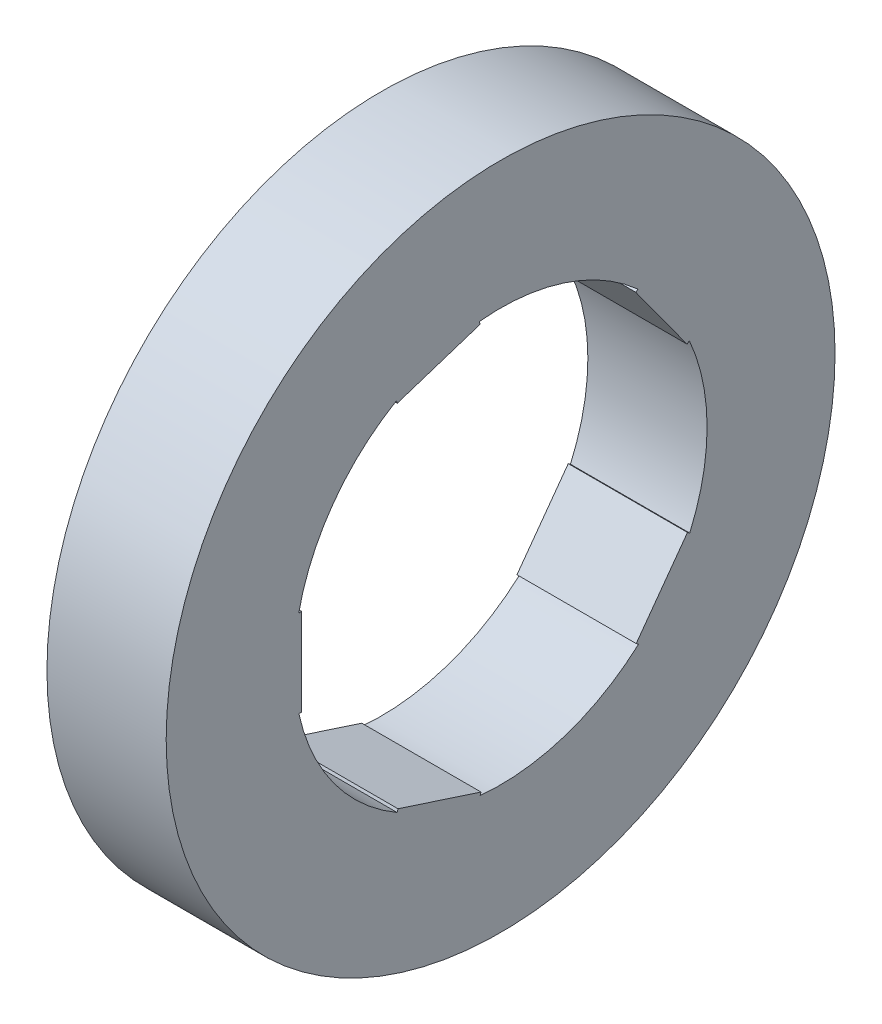
ISO-10303-21;
HEADER;
FILE_DESCRIPTION(('STEP AP214'),'2;1');
FILE_NAME('part.step','',(''),(''),'','','');
FILE_SCHEMA(('AUTOMOTIVE_DESIGN { 1 0 10303 214 1 1 1 1 }'));
ENDSEC;
DATA;
#1=APPLICATION_CONTEXT('core data for automotive mechanical design processes');
#2=APPLICATION_PROTOCOL_DEFINITION('international standard','automotive_design',2000,#1);
#3=PRODUCT_CONTEXT('',#1,'mechanical');
#4=PRODUCT('Part','Part','',(#3));
#5=PRODUCT_RELATED_PRODUCT_CATEGORY('part','',(#4));
#6=PRODUCT_DEFINITION_FORMATION('','',#4);
#7=PRODUCT_DEFINITION_CONTEXT('part definition',#1,'design');
#8=PRODUCT_DEFINITION('design','',#6,#7);
#9=PRODUCT_DEFINITION_SHAPE('','',#8);
#10=(LENGTH_UNIT() NAMED_UNIT(*) SI_UNIT(.MILLI.,.METRE.));
#11=(NAMED_UNIT(*) PLANE_ANGLE_UNIT() SI_UNIT($,.RADIAN.));
#12=(NAMED_UNIT(*) SI_UNIT($,.STERADIAN.) SOLID_ANGLE_UNIT());
#13=UNCERTAINTY_MEASURE_WITH_UNIT(LENGTH_MEASURE(1.E-05),#10,'distance_accuracy_value','');
#14=(GEOMETRIC_REPRESENTATION_CONTEXT(3) GLOBAL_UNCERTAINTY_ASSIGNED_CONTEXT((#13)) GLOBAL_UNIT_ASSIGNED_CONTEXT((#10,
#11,#12)) REPRESENTATION_CONTEXT('',''));
#15=CARTESIAN_POINT('',(0.,0.,0.));
#16=DIRECTION('',(0.,0.,1.));
#17=DIRECTION('',(1.,0.,0.));
#18=AXIS2_PLACEMENT_3D('',#15,#16,#17);
#19=CARTESIAN_POINT('',(77.,0.,0.));
#20=DIRECTION('',(-1.,0.,0.));
#21=DIRECTION('',(0.,0.,1.));
#22=AXIS2_PLACEMENT_3D('',#19,#20,#21);
#23=CYLINDRICAL_SURFACE('',#22,11.5);
#24=CARTESIAN_POINT('',(77.,0.,0.));
#25=DIRECTION('',(1.,0.,0.));
#26=DIRECTION('',(0.,0.,-1.));
#27=AXIS2_PLACEMENT_3D('',#24,#25,#26);
#28=CIRCLE('',#27,11.5);
#29=CARTESIAN_POINT('',(77.,0.,-11.5));
#30=VERTEX_POINT('',#29);
#31=EDGE_CURVE('E11',#30,#30,#28,.T.);
#32=ORIENTED_EDGE('',*,*,#31,.F.);
#33=EDGE_LOOP('',(#32));
#34=FACE_BOUND('',#33,.T.);
#35=CARTESIAN_POINT('',(72.9,0.,0.));
#36=DIRECTION('',(-1.,0.,0.));
#37=DIRECTION('',(0.,0.,1.));
#38=AXIS2_PLACEMENT_3D('',#35,#36,#37);
#39=CIRCLE('',#38,11.5);
#40=CARTESIAN_POINT('',(72.9,0.,11.5));
#41=VERTEX_POINT('',#40);
#42=EDGE_CURVE('E195',#41,#41,#39,.T.);
#43=ORIENTED_EDGE('',*,*,#42,.F.);
#44=EDGE_LOOP('',(#43));
#45=FACE_BOUND('',#44,.T.);
#46=ADVANCED_FACE('F35',(#34,#45),#23,.T.);
#47=CARTESIAN_POINT('',(77.,0.,0.));
#48=DIRECTION('',(1.,0.,0.));
#49=DIRECTION('',(0.,0.,-1.));
#50=AXIS2_PLACEMENT_3D('',#47,#48,#49);
#51=PLANE('',#50);
#52=CARTESIAN_POINT('',(77.,0.,0.));
#53=DIRECTION('',(1.,0.,0.));
#54=DIRECTION('',(0.,0.,-1.));
#55=AXIS2_PLACEMENT_3D('',#52,#53,#54);
#56=CIRCLE('',#55,7.1);
#57=CARTESIAN_POINT('',(77.,6.12954192232623,3.58311537944918));
#58=VERTEX_POINT('',#57);
#59=CARTESIAN_POINT('',(77.,1.48638739146996,6.94266897687619));
#60=VERTEX_POINT('',#59);
#61=EDGE_CURVE('E49',#58,#60,#56,.T.);
#62=ORIENTED_EDGE('',*,*,#61,.F.);
#63=DIRECTION('',(0.,0.951056516295151,0.309016994374954));
#64=VECTOR('',#63,1.);
#65=CARTESIAN_POINT('',(77.,6.04003290037282,3.55403213522597));
#66=LINE('',#65,#64);
#67=CARTESIAN_POINT('',(77.,6.04003290037282,3.55403213522597));
#68=VERTEX_POINT('',#67);
#69=EDGE_CURVE('E125',#68,#58,#66,.T.);
#70=ORIENTED_EDGE('',*,*,#69,.F.);
#71=DIRECTION('',(0.,-0.309016994374948,0.951056516295153));
#72=VECTOR('',#71,1.);
#73=CARTESIAN_POINT('',(77.,6.96708388349766,0.700862586340513));
#74=LINE('',#73,#72);
#75=CARTESIAN_POINT('',(77.,6.96708388349766,0.700862586340513));
#76=VERTEX_POINT('',#75);
#77=EDGE_CURVE('E133',#76,#68,#74,.T.);
#78=ORIENTED_EDGE('',*,*,#77,.F.);
#79=DIRECTION('',(0.,-0.951056516295153,-0.30901699437495));
#80=VECTOR('',#79,1.);
#81=CARTESIAN_POINT('',(77.,7.06218953512718,0.731764285778008));
#82=LINE('',#81,#80);
#83=CARTESIAN_POINT('',(77.,7.06218953512718,0.731764285778009));
#84=VERTEX_POINT('',#83);
#85=EDGE_CURVE('E139',#84,#76,#82,.T.);
#86=ORIENTED_EDGE('',*,*,#85,.F.);
#87=CARTESIAN_POINT('',(77.,0.,0.));
#88=DIRECTION('',(1.,0.,0.));
#89=DIRECTION('',(0.,0.,-1.));
#90=AXIS2_PLACEMENT_3D('',#87,#88,#89);
#91=CIRCLE('',#90,7.1);
#92=CARTESIAN_POINT('',(77.,5.30187785199502,-4.72229724207665));
#93=VERTEX_POINT('',#92);
#94=EDGE_CURVE('E239',#93,#84,#91,.T.);
#95=ORIENTED_EDGE('',*,*,#94,.F.);
#96=DIRECTION('',(0.,0.587785252292473,-0.809016994374947));
#97=VECTOR('',#96,1.);
#98=CARTESIAN_POINT('',(77.,5.24655823412805,-4.64615632019718));
#99=LINE('',#98,#97);
#100=CARTESIAN_POINT('',(77.,5.24655823412805,-4.64615632019718));
#101=VERTEX_POINT('',#100);
#102=EDGE_CURVE('E236',#101,#93,#99,.T.);
#103=ORIENTED_EDGE('',*,*,#102,.F.);
#104=DIRECTION('',(0.,0.809016994374947,0.587785252292473));
#105=VECTOR('',#104,1.);
#106=CARTESIAN_POINT('',(77.,2.8195072510032,-6.4095120770746));
#107=LINE('',#106,#105);
#108=CARTESIAN_POINT('',(77.,2.8195072510032,-6.4095120770746));
#109=VERTEX_POINT('',#108);
#110=EDGE_CURVE('E233',#109,#101,#107,.T.);
#111=ORIENTED_EDGE('',*,*,#110,.F.);
#112=DIRECTION('',(0.,-0.587785252292469,0.809016994374951));
#113=VECTOR('',#112,1.);
#114=CARTESIAN_POINT('',(77.,2.87828577623245,-6.49041377651209));
#115=LINE('',#114,#113);
#116=CARTESIAN_POINT('',(77.,2.87828577623245,-6.49041377651209));
#117=VERTEX_POINT('',#116);
#118=EDGE_CURVE('E230',#117,#109,#115,.T.);
#119=ORIENTED_EDGE('',*,*,#118,.F.);
#120=CARTESIAN_POINT('',(77.,0.,0.));
#121=DIRECTION('',(1.,0.,0.));
#122=DIRECTION('',(0.,0.,-1.));
#123=AXIS2_PLACEMENT_3D('',#120,#121,#122);
#124=CIRCLE('',#123,7.1);
#125=CARTESIAN_POINT('',(77.,-2.85280120559303,-6.50165558003244));
#126=VERTEX_POINT('',#125);
#127=EDGE_CURVE('E227',#126,#117,#124,.T.);
#128=ORIENTED_EDGE('',*,*,#127,.F.);
#129=DIRECTION('',(0.,-0.587785252292474,-0.809016994374946));
#130=VECTOR('',#129,1.);
#131=CARTESIAN_POINT('',(77.,-2.79748158772606,-6.42551465815297));
#132=LINE('',#131,#130);
#133=CARTESIAN_POINT('',(77.,-2.79748158772606,-6.42551465815297));
#134=VERTEX_POINT('',#133);
#135=EDGE_CURVE('E224',#134,#126,#132,.T.);
#136=ORIENTED_EDGE('',*,*,#135,.F.);
#137=DIRECTION('',(0.,0.809016994374947,-0.587785252292473));
#138=VECTOR('',#137,1.);
#139=CARTESIAN_POINT('',(77.,-5.2245325708509,-4.66215890127555));
#140=LINE('',#139,#138);
#141=CARTESIAN_POINT('',(77.,-5.2245325708509,-4.66215890127555));
#142=VERTEX_POINT('',#141);
#143=EDGE_CURVE('E221',#142,#134,#140,.T.);
#144=ORIENTED_EDGE('',*,*,#143,.F.);
#145=DIRECTION('',(0.,0.587785252292469,0.809016994374951));
#146=VECTOR('',#145,1.);
#147=CARTESIAN_POINT('',(77.,-5.28331109608015,-4.74306060071305));
#148=LINE('',#147,#146);
#149=CARTESIAN_POINT('',(77.,-5.28331109608015,-4.74306060071304));
#150=VERTEX_POINT('',#149);
#151=EDGE_CURVE('E218',#150,#142,#148,.T.);
#152=ORIENTED_EDGE('',*,*,#151,.F.);
#153=CARTESIAN_POINT('',(77.,0.,0.));
#154=DIRECTION('',(1.,0.,0.));
#155=DIRECTION('',(0.,0.,-1.));
#156=AXIS2_PLACEMENT_3D('',#153,#154,#155);
#157=CIRCLE('',#156,7.1);
#158=CARTESIAN_POINT('',(77.,-7.06500596019818,0.704053110471187));
#159=VERTEX_POINT('',#158);
#160=EDGE_CURVE('E215',#159,#150,#157,.T.);
#161=ORIENTED_EDGE('',*,*,#160,.F.);
#162=DIRECTION('',(0.,-0.951056516295154,0.309016994374946));
#163=VECTOR('',#162,1.);
#164=CARTESIAN_POINT('',(77.,-6.97549693824477,0.674969866247979));
#165=LINE('',#164,#163);
#166=CARTESIAN_POINT('',(77.,-6.97549693824477,0.674969866247979));
#167=VERTEX_POINT('',#166);
#168=EDGE_CURVE('E212',#167,#159,#165,.T.);
#169=ORIENTED_EDGE('',*,*,#168,.F.);
#170=DIRECTION('',(0.,-0.309016994374947,-0.951056516295154));
#171=VECTOR('',#170,1.);
#172=CARTESIAN_POINT('',(77.,-6.04844595511993,3.52813941513344));
#173=LINE('',#172,#171);
#174=CARTESIAN_POINT('',(77.,-6.04844595511993,3.52813941513344));
#175=VERTEX_POINT('',#174);
#176=EDGE_CURVE('E209',#175,#167,#173,.T.);
#177=ORIENTED_EDGE('',*,*,#176,.F.);
#178=DIRECTION('',(0.,0.951056516295154,-0.309016994374946));
#179=VECTOR('',#178,1.);
#180=CARTESIAN_POINT('',(77.,-6.14355160674944,3.55904111457094));
#181=LINE('',#180,#179);
#182=CARTESIAN_POINT('',(77.,-6.14355160674944,3.55904111457094));
#183=VERTEX_POINT('',#182);
#184=EDGE_CURVE('E206',#183,#175,#181,.T.);
#185=ORIENTED_EDGE('',*,*,#184,.F.);
#186=CARTESIAN_POINT('',(77.,0.,0.));
#187=DIRECTION('',(1.,0.,0.));
#188=DIRECTION('',(0.,0.,-1.));
#189=AXIS2_PLACEMENT_3D('',#186,#187,#188);
#190=CIRCLE('',#189,7.1);
#191=CARTESIAN_POINT('',(77.,-1.51361260853004,6.93678433218872));
#192=VERTEX_POINT('',#191);
#193=EDGE_CURVE('E203',#192,#183,#190,.T.);
#194=ORIENTED_EDGE('',*,*,#193,.F.);
#195=DIRECTION('',(0.,0.,1.));
#196=VECTOR('',#195,1.);
#197=CARTESIAN_POINT('',(77.,-1.51361260853004,6.84266897687619));
#198=LINE('',#197,#196);
#199=CARTESIAN_POINT('',(77.,-1.51361260853004,6.84266897687619));
#200=VERTEX_POINT('',#199);
#201=EDGE_CURVE('E200',#200,#192,#198,.T.);
#202=ORIENTED_EDGE('',*,*,#201,.F.);
#203=DIRECTION('',(0.,-1.,0.));
#204=VECTOR('',#203,1.);
#205=CARTESIAN_POINT('',(77.,1.48638739146996,6.84266897687619));
#206=LINE('',#205,#204);
#207=CARTESIAN_POINT('',(77.,1.48638739146996,6.84266897687619));
#208=VERTEX_POINT('',#207);
#209=EDGE_CURVE('E197',#208,#200,#206,.T.);
#210=ORIENTED_EDGE('',*,*,#209,.F.);
#211=DIRECTION('',(0.,0.,-1.));
#212=VECTOR('',#211,1.);
#213=CARTESIAN_POINT('',(77.,1.48638739146996,6.94266897687619));
#214=LINE('',#213,#212);
#215=EDGE_CURVE('E194',#60,#208,#214,.T.);
#216=ORIENTED_EDGE('',*,*,#215,.F.);
#217=EDGE_LOOP('',(#62,#70,#78,#86,#95,#103,#111,#119,#128,#136,#144,#152,#161,#169,#177,#185,
#194,#202,#210,#216));
#218=FACE_BOUND('',#217,.T.);
#219=ORIENTED_EDGE('',*,*,#31,.T.);
#220=EDGE_LOOP('',(#219));
#221=FACE_BOUND('',#220,.T.);
#222=ADVANCED_FACE('F141',(#218,#221),#51,.T.);
#223=CARTESIAN_POINT('',(72.9,0.,0.));
#224=DIRECTION('',(1.,0.,0.));
#225=DIRECTION('',(0.,0.,-1.));
#226=AXIS2_PLACEMENT_3D('',#223,#224,#225);
#227=CYLINDRICAL_SURFACE('',#226,7.1);
#228=ORIENTED_EDGE('',*,*,#61,.T.);
#229=DIRECTION('',(1.,0.,0.));
#230=VECTOR('',#229,1.);
#231=CARTESIAN_POINT('',(72.9,1.48638739146996,6.94266897687619));
#232=LINE('',#231,#230);
#233=CARTESIAN_POINT('',(72.9,1.48638739146996,6.94266897687619));
#234=VERTEX_POINT('',#233);
#235=EDGE_CURVE('E182',#234,#60,#232,.T.);
#236=ORIENTED_EDGE('',*,*,#235,.F.);
#237=CARTESIAN_POINT('',(72.9,0.,0.));
#238=DIRECTION('',(1.,0.,0.));
#239=DIRECTION('',(0.,0.,-1.));
#240=AXIS2_PLACEMENT_3D('',#237,#238,#239);
#241=CIRCLE('',#240,7.1);
#242=CARTESIAN_POINT('',(72.9,6.12954192232623,3.58311537944918));
#243=VERTEX_POINT('',#242);
#244=EDGE_CURVE('E58',#243,#234,#241,.T.);
#245=ORIENTED_EDGE('',*,*,#244,.F.);
#246=DIRECTION('',(1.,0.,0.));
#247=VECTOR('',#246,1.);
#248=CARTESIAN_POINT('',(72.9,6.12954192232623,3.58311537944918));
#249=LINE('',#248,#247);
#250=EDGE_CURVE('E42',#243,#58,#249,.T.);
#251=ORIENTED_EDGE('',*,*,#250,.T.);
#252=EDGE_LOOP('',(#228,#236,#245,#251));
#253=FACE_BOUND('',#252,.T.);
#254=ADVANCED_FACE('F415',(#253),#227,.F.);
#255=CARTESIAN_POINT('',(72.9,6.04003290037282,3.55403213522597));
#256=DIRECTION('',(0.,0.309016994374954,-0.951056516295152));
#257=DIRECTION('',(0.,0.951056516295152,0.309016994374954));
#258=AXIS2_PLACEMENT_3D('',#255,#256,#257);
#259=PLANE('',#258);
#260=ORIENTED_EDGE('',*,*,#69,.T.);
#261=ORIENTED_EDGE('',*,*,#250,.F.);
#262=DIRECTION('',(0.,0.951056516295151,0.309016994374954));
#263=VECTOR('',#262,1.);
#264=CARTESIAN_POINT('',(72.9,6.04003290037282,3.55403213522597));
#265=LINE('',#264,#263);
#266=CARTESIAN_POINT('',(72.9,6.04003290037282,3.55403213522597));
#267=VERTEX_POINT('',#266);
#268=EDGE_CURVE('E127',#267,#243,#265,.T.);
#269=ORIENTED_EDGE('',*,*,#268,.F.);
#270=DIRECTION('',(1.,0.,0.));
#271=VECTOR('',#270,1.);
#272=CARTESIAN_POINT('',(72.9,6.04003290037282,3.55403213522597));
#273=LINE('',#272,#271);
#274=EDGE_CURVE('E120',#267,#68,#273,.T.);
#275=ORIENTED_EDGE('',*,*,#274,.T.);
#276=EDGE_LOOP('',(#260,#261,#269,#275));
#277=FACE_BOUND('',#276,.T.);
#278=ADVANCED_FACE('F122',(#277),#259,.F.);
#279=CARTESIAN_POINT('',(72.9,6.96708388349766,0.700862586340513));
#280=DIRECTION('',(0.,0.951056516295154,0.309016994374948));
#281=DIRECTION('',(0.,-0.309016994374948,0.951056516295154));
#282=AXIS2_PLACEMENT_3D('',#279,#280,#281);
#283=PLANE('',#282);
#284=ORIENTED_EDGE('',*,*,#77,.T.);
#285=ORIENTED_EDGE('',*,*,#274,.F.);
#286=DIRECTION('',(0.,-0.309016994374948,0.951056516295153));
#287=VECTOR('',#286,1.);
#288=CARTESIAN_POINT('',(72.9,6.96708388349766,0.700862586340513));
#289=LINE('',#288,#287);
#290=CARTESIAN_POINT('',(72.9,6.96708388349766,0.700862586340513));
#291=VERTEX_POINT('',#290);
#292=EDGE_CURVE('E186',#291,#267,#289,.T.);
#293=ORIENTED_EDGE('',*,*,#292,.F.);
#294=DIRECTION('',(1.,0.,0.));
#295=VECTOR('',#294,1.);
#296=CARTESIAN_POINT('',(72.9,6.96708388349766,0.700862586340513));
#297=LINE('',#296,#295);
#298=EDGE_CURVE('E130',#291,#76,#297,.T.);
#299=ORIENTED_EDGE('',*,*,#298,.T.);
#300=EDGE_LOOP('',(#284,#285,#293,#299));
#301=FACE_BOUND('',#300,.T.);
#302=ADVANCED_FACE('F134',(#301),#283,.F.);
#303=CARTESIAN_POINT('',(72.9,7.06218953512718,0.731764285778008));
#304=DIRECTION('',(0.,-0.30901699437495,0.951056516295153));
#305=DIRECTION('',(0.,-0.951056516295153,-0.30901699437495));
#306=AXIS2_PLACEMENT_3D('',#303,#304,#305);
#307=PLANE('',#306);
#308=ORIENTED_EDGE('',*,*,#85,.T.);
#309=ORIENTED_EDGE('',*,*,#298,.F.);
#310=DIRECTION('',(0.,-0.951056516295153,-0.30901699437495));
#311=VECTOR('',#310,1.);
#312=CARTESIAN_POINT('',(72.9,7.06218953512718,0.731764285778008));
#313=LINE('',#312,#311);
#314=CARTESIAN_POINT('',(72.9,7.06218953512718,0.731764285778009));
#315=VERTEX_POINT('',#314);
#316=EDGE_CURVE('E189',#315,#291,#313,.T.);
#317=ORIENTED_EDGE('',*,*,#316,.F.);
#318=DIRECTION('',(1.,0.,0.));
#319=VECTOR('',#318,1.);
#320=CARTESIAN_POINT('',(72.9,7.06218953512718,0.731764285778009));
#321=LINE('',#320,#319);
#322=EDGE_CURVE('E151',#315,#84,#321,.T.);
#323=ORIENTED_EDGE('',*,*,#322,.T.);
#324=EDGE_LOOP('',(#308,#309,#317,#323));
#325=FACE_BOUND('',#324,.T.);
#326=ADVANCED_FACE('F242',(#325),#307,.F.);
#327=CARTESIAN_POINT('',(72.9,0.,0.));
#328=DIRECTION('',(1.,0.,0.));
#329=DIRECTION('',(0.,0.,-1.));
#330=AXIS2_PLACEMENT_3D('',#327,#328,#329);
#331=CYLINDRICAL_SURFACE('',#330,7.1);
#332=ORIENTED_EDGE('',*,*,#94,.T.);
#333=ORIENTED_EDGE('',*,*,#322,.F.);
#334=CARTESIAN_POINT('',(72.9,0.,0.));
#335=DIRECTION('',(1.,0.,0.));
#336=DIRECTION('',(0.,0.,-1.));
#337=AXIS2_PLACEMENT_3D('',#334,#335,#336);
#338=CIRCLE('',#337,7.1);
#339=CARTESIAN_POINT('',(72.9,5.30187785199502,-4.72229724207665));
#340=VERTEX_POINT('',#339);
#341=EDGE_CURVE('E256',#340,#315,#338,.T.);
#342=ORIENTED_EDGE('',*,*,#341,.F.);
#343=DIRECTION('',(1.,0.,0.));
#344=VECTOR('',#343,1.);
#345=CARTESIAN_POINT('',(72.9,5.30187785199502,-4.72229724207665));
#346=LINE('',#345,#344);
#347=EDGE_CURVE('E153',#340,#93,#346,.T.);
#348=ORIENTED_EDGE('',*,*,#347,.T.);
#349=EDGE_LOOP('',(#332,#333,#342,#348));
#350=FACE_BOUND('',#349,.T.);
#351=ADVANCED_FACE('F250',(#350),#331,.F.);
#352=CARTESIAN_POINT('',(72.9,5.24655823412805,-4.64615632019718));
#353=DIRECTION('',(0.,-0.809016994374947,-0.587785252292473));
#354=DIRECTION('',(0.,0.587785252292473,-0.809016994374947));
#355=AXIS2_PLACEMENT_3D('',#352,#353,#354);
#356=PLANE('',#355);
#357=ORIENTED_EDGE('',*,*,#102,.T.);
#358=ORIENTED_EDGE('',*,*,#347,.F.);
#359=DIRECTION('',(0.,0.587785252292473,-0.809016994374947));
#360=VECTOR('',#359,1.);
#361=CARTESIAN_POINT('',(72.9,5.24655823412805,-4.64615632019718));
#362=LINE('',#361,#360);
#363=CARTESIAN_POINT('',(72.9,5.24655823412805,-4.64615632019718));
#364=VERTEX_POINT('',#363);
#365=EDGE_CURVE('E263',#364,#340,#362,.T.);
#366=ORIENTED_EDGE('',*,*,#365,.F.);
#367=DIRECTION('',(1.,0.,0.));
#368=VECTOR('',#367,1.);
#369=CARTESIAN_POINT('',(72.9,5.24655823412805,-4.64615632019718));
#370=LINE('',#369,#368);
#371=EDGE_CURVE('E155',#364,#101,#370,.T.);
#372=ORIENTED_EDGE('',*,*,#371,.T.);
#373=EDGE_LOOP('',(#357,#358,#366,#372));
#374=FACE_BOUND('',#373,.T.);
#375=ADVANCED_FACE('F259',(#374),#356,.F.);
#376=CARTESIAN_POINT('',(72.9,2.8195072510032,-6.4095120770746));
#377=DIRECTION('',(0.,0.587785252292473,-0.809016994374947));
#378=DIRECTION('',(0.,0.809016994374947,0.587785252292473));
#379=AXIS2_PLACEMENT_3D('',#376,#377,#378);
#380=PLANE('',#379);
#381=ORIENTED_EDGE('',*,*,#110,.T.);
#382=ORIENTED_EDGE('',*,*,#371,.F.);
#383=DIRECTION('',(0.,0.809016994374947,0.587785252292473));
#384=VECTOR('',#383,1.);
#385=CARTESIAN_POINT('',(72.9,2.8195072510032,-6.4095120770746));
#386=LINE('',#385,#384);
#387=CARTESIAN_POINT('',(72.9,2.8195072510032,-6.4095120770746));
#388=VERTEX_POINT('',#387);
#389=EDGE_CURVE('E381',#388,#364,#386,.T.);
#390=ORIENTED_EDGE('',*,*,#389,.F.);
#391=DIRECTION('',(1.,0.,0.));
#392=VECTOR('',#391,1.);
#393=CARTESIAN_POINT('',(72.9,2.8195072510032,-6.4095120770746));
#394=LINE('',#393,#392);
#395=EDGE_CURVE('E157',#388,#109,#394,.T.);
#396=ORIENTED_EDGE('',*,*,#395,.T.);
#397=EDGE_LOOP('',(#381,#382,#390,#396));
#398=FACE_BOUND('',#397,.T.);
#399=ADVANCED_FACE('F266',(#398),#380,.F.);
#400=CARTESIAN_POINT('',(72.9,2.87828577623245,-6.49041377651209));
#401=DIRECTION('',(0.,0.809016994374951,0.587785252292469));
#402=DIRECTION('',(0.,-0.587785252292469,0.809016994374951));
#403=AXIS2_PLACEMENT_3D('',#400,#401,#402);
#404=PLANE('',#403);
#405=ORIENTED_EDGE('',*,*,#118,.T.);
#406=ORIENTED_EDGE('',*,*,#395,.F.);
#407=DIRECTION('',(0.,-0.587785252292469,0.809016994374951));
#408=VECTOR('',#407,1.);
#409=CARTESIAN_POINT('',(72.9,2.87828577623245,-6.49041377651209));
#410=LINE('',#409,#408);
#411=CARTESIAN_POINT('',(72.9,2.87828577623245,-6.49041377651209));
#412=VERTEX_POINT('',#411);
#413=EDGE_CURVE('E278',#412,#388,#410,.T.);
#414=ORIENTED_EDGE('',*,*,#413,.F.);
#415=DIRECTION('',(1.,0.,0.));
#416=VECTOR('',#415,1.);
#417=CARTESIAN_POINT('',(72.9,2.87828577623245,-6.49041377651209));
#418=LINE('',#417,#416);
#419=EDGE_CURVE('E159',#412,#117,#418,.T.);
#420=ORIENTED_EDGE('',*,*,#419,.T.);
#421=EDGE_LOOP('',(#405,#406,#414,#420));
#422=FACE_BOUND('',#421,.T.);
#423=ADVANCED_FACE('F272',(#422),#404,.F.);
#424=CARTESIAN_POINT('',(72.9,0.,0.));
#425=DIRECTION('',(1.,0.,0.));
#426=DIRECTION('',(0.,0.,-1.));
#427=AXIS2_PLACEMENT_3D('',#424,#425,#426);
#428=CYLINDRICAL_SURFACE('',#427,7.1);
#429=ORIENTED_EDGE('',*,*,#127,.T.);
#430=ORIENTED_EDGE('',*,*,#419,.F.);
#431=CARTESIAN_POINT('',(72.9,0.,0.));
#432=DIRECTION('',(1.,0.,0.));
#433=DIRECTION('',(0.,0.,-1.));
#434=AXIS2_PLACEMENT_3D('',#431,#432,#433);
#435=CIRCLE('',#434,7.1);
#436=CARTESIAN_POINT('',(72.9,-2.85280120559303,-6.50165558003244));
#437=VERTEX_POINT('',#436);
#438=EDGE_CURVE('E285',#437,#412,#435,.T.);
#439=ORIENTED_EDGE('',*,*,#438,.F.);
#440=DIRECTION('',(1.,0.,0.));
#441=VECTOR('',#440,1.);
#442=CARTESIAN_POINT('',(72.9,-2.85280120559303,-6.50165558003244));
#443=LINE('',#442,#441);
#444=EDGE_CURVE('E161',#437,#126,#443,.T.);
#445=ORIENTED_EDGE('',*,*,#444,.T.);
#446=EDGE_LOOP('',(#429,#430,#439,#445));
#447=FACE_BOUND('',#446,.T.);
#448=ADVANCED_FACE('F281',(#447),#428,.F.);
#449=CARTESIAN_POINT('',(72.9,-2.79748158772606,-6.42551465815297));
#450=DIRECTION('',(0.,-0.809016994374946,0.587785252292474));
#451=DIRECTION('',(0.,-0.587785252292474,-0.809016994374946));
#452=AXIS2_PLACEMENT_3D('',#449,#450,#451);
#453=PLANE('',#452);
#454=ORIENTED_EDGE('',*,*,#135,.T.);
#455=ORIENTED_EDGE('',*,*,#444,.F.);
#456=DIRECTION('',(0.,-0.587785252292474,-0.809016994374946));
#457=VECTOR('',#456,1.);
#458=CARTESIAN_POINT('',(72.9,-2.79748158772606,-6.42551465815297));
#459=LINE('',#458,#457);
#460=CARTESIAN_POINT('',(72.9,-2.79748158772606,-6.42551465815297));
#461=VERTEX_POINT('',#460);
#462=EDGE_CURVE('E376',#461,#437,#459,.T.);
#463=ORIENTED_EDGE('',*,*,#462,.F.);
#464=DIRECTION('',(1.,0.,0.));
#465=VECTOR('',#464,1.);
#466=CARTESIAN_POINT('',(72.9,-2.79748158772606,-6.42551465815297));
#467=LINE('',#466,#465);
#468=EDGE_CURVE('E163',#461,#134,#467,.T.);
#469=ORIENTED_EDGE('',*,*,#468,.T.);
#470=EDGE_LOOP('',(#454,#455,#463,#469));
#471=FACE_BOUND('',#470,.T.);
#472=ADVANCED_FACE('F288',(#471),#453,.F.);
#473=CARTESIAN_POINT('',(72.9,-5.2245325708509,-4.66215890127555));
#474=DIRECTION('',(0.,-0.587785252292473,-0.809016994374947));
#475=DIRECTION('',(0.,0.809016994374948,-0.587785252292473));
#476=AXIS2_PLACEMENT_3D('',#473,#474,#475);
#477=PLANE('',#476);
#478=ORIENTED_EDGE('',*,*,#143,.T.);
#479=ORIENTED_EDGE('',*,*,#468,.F.);
#480=DIRECTION('',(0.,0.809016994374947,-0.587785252292473));
#481=VECTOR('',#480,1.);
#482=CARTESIAN_POINT('',(72.9,-5.2245325708509,-4.66215890127555));
#483=LINE('',#482,#481);
#484=CARTESIAN_POINT('',(72.9,-5.2245325708509,-4.66215890127555));
#485=VERTEX_POINT('',#484);
#486=EDGE_CURVE('E300',#485,#461,#483,.T.);
#487=ORIENTED_EDGE('',*,*,#486,.F.);
#488=DIRECTION('',(1.,0.,0.));
#489=VECTOR('',#488,1.);
#490=CARTESIAN_POINT('',(72.9,-5.2245325708509,-4.66215890127555));
#491=LINE('',#490,#489);
#492=EDGE_CURVE('E165',#485,#142,#491,.T.);
#493=ORIENTED_EDGE('',*,*,#492,.T.);
#494=EDGE_LOOP('',(#478,#479,#487,#493));
#495=FACE_BOUND('',#494,.T.);
#496=ADVANCED_FACE('F294',(#495),#477,.F.);
#497=CARTESIAN_POINT('',(72.9,-5.28331109608015,-4.74306060071305));
#498=DIRECTION('',(0.,0.809016994374951,-0.587785252292469));
#499=DIRECTION('',(0.,0.587785252292469,0.809016994374951));
#500=AXIS2_PLACEMENT_3D('',#497,#498,#499);
#501=PLANE('',#500);
#502=ORIENTED_EDGE('',*,*,#151,.T.);
#503=ORIENTED_EDGE('',*,*,#492,.F.);
#504=DIRECTION('',(0.,0.587785252292469,0.809016994374951));
#505=VECTOR('',#504,1.);
#506=CARTESIAN_POINT('',(72.9,-5.28331109608015,-4.74306060071305));
#507=LINE('',#506,#505);
#508=CARTESIAN_POINT('',(72.9,-5.28331109608015,-4.74306060071304));
#509=VERTEX_POINT('',#508);
#510=EDGE_CURVE('E307',#509,#485,#507,.T.);
#511=ORIENTED_EDGE('',*,*,#510,.F.);
#512=DIRECTION('',(1.,0.,0.));
#513=VECTOR('',#512,1.);
#514=CARTESIAN_POINT('',(72.9,-5.28331109608015,-4.74306060071304));
#515=LINE('',#514,#513);
#516=EDGE_CURVE('E167',#509,#150,#515,.T.);
#517=ORIENTED_EDGE('',*,*,#516,.T.);
#518=EDGE_LOOP('',(#502,#503,#511,#517));
#519=FACE_BOUND('',#518,.T.);
#520=ADVANCED_FACE('F303',(#519),#501,.F.);
#521=CARTESIAN_POINT('',(72.9,0.,0.));
#522=DIRECTION('',(1.,0.,0.));
#523=DIRECTION('',(0.,0.,-1.));
#524=AXIS2_PLACEMENT_3D('',#521,#522,#523);
#525=CYLINDRICAL_SURFACE('',#524,7.1);
#526=ORIENTED_EDGE('',*,*,#160,.T.);
#527=ORIENTED_EDGE('',*,*,#516,.F.);
#528=CARTESIAN_POINT('',(72.9,0.,0.));
#529=DIRECTION('',(1.,0.,0.));
#530=DIRECTION('',(0.,0.,-1.));
#531=AXIS2_PLACEMENT_3D('',#528,#529,#530);
#532=CIRCLE('',#531,7.1);
#533=CARTESIAN_POINT('',(72.9,-7.06500596019818,0.704053110471187));
#534=VERTEX_POINT('',#533);
#535=EDGE_CURVE('E371',#534,#509,#532,.T.);
#536=ORIENTED_EDGE('',*,*,#535,.F.);
#537=DIRECTION('',(1.,0.,0.));
#538=VECTOR('',#537,1.);
#539=CARTESIAN_POINT('',(72.9,-7.06500596019818,0.704053110471187));
#540=LINE('',#539,#538);
#541=EDGE_CURVE('E169',#534,#159,#540,.T.);
#542=ORIENTED_EDGE('',*,*,#541,.T.);
#543=EDGE_LOOP('',(#526,#527,#536,#542));
#544=FACE_BOUND('',#543,.T.);
#545=ADVANCED_FACE('F310',(#544),#525,.F.);
#546=CARTESIAN_POINT('',(72.9,-6.97549693824477,0.674969866247979));
#547=DIRECTION('',(0.,0.309016994374946,0.951056516295154));
#548=DIRECTION('',(0.,-0.951056516295154,0.309016994374946));
#549=AXIS2_PLACEMENT_3D('',#546,#547,#548);
#550=PLANE('',#549);
#551=ORIENTED_EDGE('',*,*,#168,.T.);
#552=ORIENTED_EDGE('',*,*,#541,.F.);
#553=DIRECTION('',(0.,-0.951056516295154,0.309016994374946));
#554=VECTOR('',#553,1.);
#555=CARTESIAN_POINT('',(72.9,-6.97549693824477,0.674969866247979));
#556=LINE('',#555,#554);
#557=CARTESIAN_POINT('',(72.9,-6.97549693824477,0.67496986624798));
#558=VERTEX_POINT('',#557);
#559=EDGE_CURVE('E322',#558,#534,#556,.T.);
#560=ORIENTED_EDGE('',*,*,#559,.F.);
#561=DIRECTION('',(1.,0.,0.));
#562=VECTOR('',#561,1.);
#563=CARTESIAN_POINT('',(72.9,-6.97549693824477,0.674969866247979));
#564=LINE('',#563,#562);
#565=EDGE_CURVE('E171',#558,#167,#564,.T.);
#566=ORIENTED_EDGE('',*,*,#565,.T.);
#567=EDGE_LOOP('',(#551,#552,#560,#566));
#568=FACE_BOUND('',#567,.T.);
#569=ADVANCED_FACE('F316',(#568),#550,.F.);
#570=CARTESIAN_POINT('',(72.9,-6.04844595511993,3.52813941513344));
#571=DIRECTION('',(0.,-0.951056516295154,0.309016994374947));
#572=DIRECTION('',(0.,-0.309016994374947,-0.951056516295154));
#573=AXIS2_PLACEMENT_3D('',#570,#571,#572);
#574=PLANE('',#573);
#575=ORIENTED_EDGE('',*,*,#176,.T.);
#576=ORIENTED_EDGE('',*,*,#565,.F.);
#577=DIRECTION('',(0.,-0.309016994374947,-0.951056516295154));
#578=VECTOR('',#577,1.);
#579=CARTESIAN_POINT('',(72.9,-6.04844595511993,3.52813941513344));
#580=LINE('',#579,#578);
#581=CARTESIAN_POINT('',(72.9,-6.04844595511993,3.52813941513344));
#582=VERTEX_POINT('',#581);
#583=EDGE_CURVE('E329',#582,#558,#580,.T.);
#584=ORIENTED_EDGE('',*,*,#583,.F.);
#585=DIRECTION('',(1.,0.,0.));
#586=VECTOR('',#585,1.);
#587=CARTESIAN_POINT('',(72.9,-6.04844595511993,3.52813941513344));
#588=LINE('',#587,#586);
#589=EDGE_CURVE('E173',#582,#175,#588,.T.);
#590=ORIENTED_EDGE('',*,*,#589,.T.);
#591=EDGE_LOOP('',(#575,#576,#584,#590));
#592=FACE_BOUND('',#591,.T.);
#593=ADVANCED_FACE('F325',(#592),#574,.F.);
#594=CARTESIAN_POINT('',(72.9,-6.14355160674944,3.55904111457094));
#595=DIRECTION('',(0.,-0.309016994374946,-0.951056516295154));
#596=DIRECTION('',(0.,0.951056516295154,-0.309016994374946));
#597=AXIS2_PLACEMENT_3D('',#594,#595,#596);
#598=PLANE('',#597);
#599=ORIENTED_EDGE('',*,*,#184,.T.);
#600=ORIENTED_EDGE('',*,*,#589,.F.);
#601=DIRECTION('',(0.,0.951056516295154,-0.309016994374946));
#602=VECTOR('',#601,1.);
#603=CARTESIAN_POINT('',(72.9,-6.14355160674944,3.55904111457094));
#604=LINE('',#603,#602);
#605=CARTESIAN_POINT('',(72.9,-6.14355160674944,3.55904111457094));
#606=VERTEX_POINT('',#605);
#607=EDGE_CURVE('E366',#606,#582,#604,.T.);
#608=ORIENTED_EDGE('',*,*,#607,.F.);
#609=DIRECTION('',(1.,0.,0.));
#610=VECTOR('',#609,1.);
#611=CARTESIAN_POINT('',(72.9,-6.14355160674944,3.55904111457094));
#612=LINE('',#611,#610);
#613=EDGE_CURVE('E175',#606,#183,#612,.T.);
#614=ORIENTED_EDGE('',*,*,#613,.T.);
#615=EDGE_LOOP('',(#599,#600,#608,#614));
#616=FACE_BOUND('',#615,.T.);
#617=ADVANCED_FACE('F332',(#616),#598,.F.);
#618=CARTESIAN_POINT('',(72.9,0.,0.));
#619=DIRECTION('',(1.,0.,0.));
#620=DIRECTION('',(0.,0.,-1.));
#621=AXIS2_PLACEMENT_3D('',#618,#619,#620);
#622=CYLINDRICAL_SURFACE('',#621,7.1);
#623=ORIENTED_EDGE('',*,*,#193,.T.);
#624=ORIENTED_EDGE('',*,*,#613,.F.);
#625=CARTESIAN_POINT('',(72.9,0.,0.));
#626=DIRECTION('',(1.,0.,0.));
#627=DIRECTION('',(0.,0.,-1.));
#628=AXIS2_PLACEMENT_3D('',#625,#626,#627);
#629=CIRCLE('',#628,7.1);
#630=CARTESIAN_POINT('',(72.9,-1.51361260853004,6.93678433218872));
#631=VERTEX_POINT('',#630);
#632=EDGE_CURVE('E344',#631,#606,#629,.T.);
#633=ORIENTED_EDGE('',*,*,#632,.F.);
#634=DIRECTION('',(1.,0.,0.));
#635=VECTOR('',#634,1.);
#636=CARTESIAN_POINT('',(72.9,-1.51361260853004,6.93678433218872));
#637=LINE('',#636,#635);
#638=EDGE_CURVE('E177',#631,#192,#637,.T.);
#639=ORIENTED_EDGE('',*,*,#638,.T.);
#640=EDGE_LOOP('',(#623,#624,#633,#639));
#641=FACE_BOUND('',#640,.T.);
#642=ADVANCED_FACE('F338',(#641),#622,.F.);
#643=CARTESIAN_POINT('',(72.9,-1.51361260853004,6.84266897687619));
#644=DIRECTION('',(0.,1.,0.));
#645=DIRECTION('',(0.,0.,1.));
#646=AXIS2_PLACEMENT_3D('',#643,#644,#645);
#647=PLANE('',#646);
#648=ORIENTED_EDGE('',*,*,#201,.T.);
#649=ORIENTED_EDGE('',*,*,#638,.F.);
#650=DIRECTION('',(0.,0.,1.));
#651=VECTOR('',#650,1.);
#652=CARTESIAN_POINT('',(72.9,-1.51361260853004,6.84266897687619));
#653=LINE('',#652,#651);
#654=CARTESIAN_POINT('',(72.9,-1.51361260853004,6.84266897687619));
#655=VERTEX_POINT('',#654);
#656=EDGE_CURVE('E351',#655,#631,#653,.T.);
#657=ORIENTED_EDGE('',*,*,#656,.F.);
#658=DIRECTION('',(1.,0.,0.));
#659=VECTOR('',#658,1.);
#660=CARTESIAN_POINT('',(72.9,-1.51361260853004,6.84266897687619));
#661=LINE('',#660,#659);
#662=EDGE_CURVE('E179',#655,#200,#661,.T.);
#663=ORIENTED_EDGE('',*,*,#662,.T.);
#664=EDGE_LOOP('',(#648,#649,#657,#663));
#665=FACE_BOUND('',#664,.T.);
#666=ADVANCED_FACE('F347',(#665),#647,.F.);
#667=CARTESIAN_POINT('',(72.9,1.48638739146996,6.84266897687619));
#668=DIRECTION('',(0.,0.,1.));
#669=DIRECTION('',(1.,0.,0.));
#670=AXIS2_PLACEMENT_3D('',#667,#668,#669);
#671=PLANE('',#670);
#672=ORIENTED_EDGE('',*,*,#209,.T.);
#673=ORIENTED_EDGE('',*,*,#662,.F.);
#674=DIRECTION('',(0.,-1.,0.));
#675=VECTOR('',#674,1.);
#676=CARTESIAN_POINT('',(72.9,1.48638739146996,6.84266897687619));
#677=LINE('',#676,#675);
#678=CARTESIAN_POINT('',(72.9,1.48638739146996,6.84266897687619));
#679=VERTEX_POINT('',#678);
#680=EDGE_CURVE('E360',#679,#655,#677,.T.);
#681=ORIENTED_EDGE('',*,*,#680,.F.);
#682=DIRECTION('',(1.,0.,0.));
#683=VECTOR('',#682,1.);
#684=CARTESIAN_POINT('',(72.9,1.48638739146996,6.84266897687619));
#685=LINE('',#684,#683);
#686=EDGE_CURVE('E181',#679,#208,#685,.T.);
#687=ORIENTED_EDGE('',*,*,#686,.T.);
#688=EDGE_LOOP('',(#672,#673,#681,#687));
#689=FACE_BOUND('',#688,.T.);
#690=ADVANCED_FACE('F354',(#689),#671,.F.);
#691=CARTESIAN_POINT('',(72.9,1.48638739146996,6.94266897687619));
#692=DIRECTION('',(0.,-1.,0.));
#693=DIRECTION('',(0.,0.,-1.));
#694=AXIS2_PLACEMENT_3D('',#691,#692,#693);
#695=PLANE('',#694);
#696=ORIENTED_EDGE('',*,*,#215,.T.);
#697=ORIENTED_EDGE('',*,*,#686,.F.);
#698=DIRECTION('',(0.,0.,-1.));
#699=VECTOR('',#698,1.);
#700=CARTESIAN_POINT('',(72.9,1.48638739146996,6.94266897687619));
#701=LINE('',#700,#699);
#702=EDGE_CURVE('E145',#234,#679,#701,.T.);
#703=ORIENTED_EDGE('',*,*,#702,.F.);
#704=ORIENTED_EDGE('',*,*,#235,.T.);
#705=EDGE_LOOP('',(#696,#697,#703,#704));
#706=FACE_BOUND('',#705,.T.);
#707=ADVANCED_FACE('F356',(#706),#695,.F.);
#708=CARTESIAN_POINT('',(72.9,0.,0.));
#709=DIRECTION('',(-1.,0.,0.));
#710=DIRECTION('',(0.,0.,1.));
#711=AXIS2_PLACEMENT_3D('',#708,#709,#710);
#712=PLANE('',#711);
#713=ORIENTED_EDGE('',*,*,#244,.T.);
#714=ORIENTED_EDGE('',*,*,#702,.T.);
#715=ORIENTED_EDGE('',*,*,#680,.T.);
#716=ORIENTED_EDGE('',*,*,#656,.T.);
#717=ORIENTED_EDGE('',*,*,#632,.T.);
#718=ORIENTED_EDGE('',*,*,#607,.T.);
#719=ORIENTED_EDGE('',*,*,#583,.T.);
#720=ORIENTED_EDGE('',*,*,#559,.T.);
#721=ORIENTED_EDGE('',*,*,#535,.T.);
#722=ORIENTED_EDGE('',*,*,#510,.T.);
#723=ORIENTED_EDGE('',*,*,#486,.T.);
#724=ORIENTED_EDGE('',*,*,#462,.T.);
#725=ORIENTED_EDGE('',*,*,#438,.T.);
#726=ORIENTED_EDGE('',*,*,#413,.T.);
#727=ORIENTED_EDGE('',*,*,#389,.T.);
#728=ORIENTED_EDGE('',*,*,#365,.T.);
#729=ORIENTED_EDGE('',*,*,#341,.T.);
#730=ORIENTED_EDGE('',*,*,#316,.T.);
#731=ORIENTED_EDGE('',*,*,#292,.T.);
#732=ORIENTED_EDGE('',*,*,#268,.T.);
#733=EDGE_LOOP('',(#713,#714,#715,#716,#717,#718,#719,#720,#721,#722,#723,#724,#725,#726,#727,
#728,#729,#730,#731,#732));
#734=FACE_BOUND('',#733,.T.);
#735=ORIENTED_EDGE('',*,*,#42,.T.);
#736=EDGE_LOOP('',(#735));
#737=FACE_BOUND('',#736,.T.);
#738=ADVANCED_FACE('F386',(#734,#737),#712,.T.);
#739=CLOSED_SHELL('',(#46,#222,#254,#278,#302,#326,#351,#375,#399,#423,#448,#472,#496,#520,#545,
#569,#593,#617,#642,#666,#690,#707,#738));
#740=MANIFOLD_SOLID_BREP('B2',#739);
#741=ADVANCED_BREP_SHAPE_REPRESENTATION('',(#18,#740),#14);
#742=SHAPE_DEFINITION_REPRESENTATION(#9,#741);
ENDSEC;
END-ISO-10303-21;
